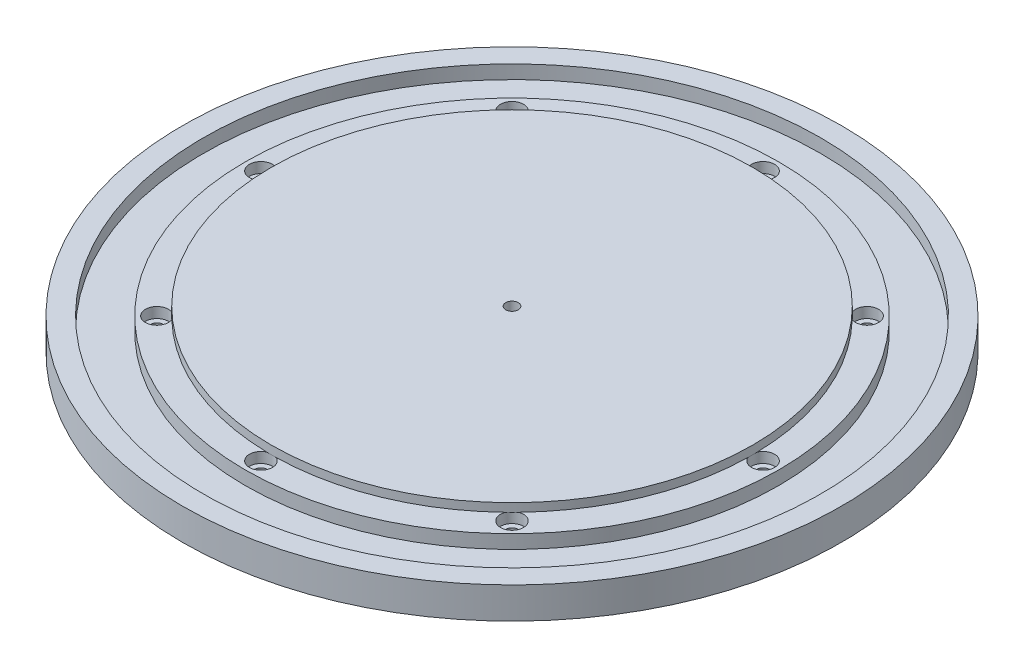
ISO-10303-21;
HEADER;
FILE_DESCRIPTION(('STEP AP214'),'2;1');
FILE_NAME('part.step','',(''),(''),'','','');
FILE_SCHEMA(('AUTOMOTIVE_DESIGN { 1 0 10303 214 1 1 1 1 }'));
ENDSEC;
DATA;
#1=APPLICATION_CONTEXT('core data for automotive mechanical design processes');
#2=APPLICATION_PROTOCOL_DEFINITION('international standard','automotive_design',2000,#1);
#3=PRODUCT_CONTEXT('',#1,'mechanical');
#4=PRODUCT('Part','Part','',(#3));
#5=PRODUCT_RELATED_PRODUCT_CATEGORY('part','',(#4));
#6=PRODUCT_DEFINITION_FORMATION('','',#4);
#7=PRODUCT_DEFINITION_CONTEXT('part definition',#1,'design');
#8=PRODUCT_DEFINITION('design','',#6,#7);
#9=PRODUCT_DEFINITION_SHAPE('','',#8);
#10=(LENGTH_UNIT() NAMED_UNIT(*) SI_UNIT(.MILLI.,.METRE.));
#11=(NAMED_UNIT(*) PLANE_ANGLE_UNIT() SI_UNIT($,.RADIAN.));
#12=(NAMED_UNIT(*) SI_UNIT($,.STERADIAN.) SOLID_ANGLE_UNIT());
#13=UNCERTAINTY_MEASURE_WITH_UNIT(LENGTH_MEASURE(1.E-05),#10,'distance_accuracy_value','');
#14=(GEOMETRIC_REPRESENTATION_CONTEXT(3) GLOBAL_UNCERTAINTY_ASSIGNED_CONTEXT((#13)) GLOBAL_UNIT_ASSIGNED_CONTEXT((#10,
#11,#12)) REPRESENTATION_CONTEXT('',''));
#15=CARTESIAN_POINT('',(0.,0.,0.));
#16=DIRECTION('',(0.,0.,1.));
#17=DIRECTION('',(1.,0.,0.));
#18=AXIS2_PLACEMENT_3D('',#15,#16,#17);
#19=CARTESIAN_POINT('',(0.,-1000.,-3.43024899888577E-12));
#20=DIRECTION('',(0.,-1.,0.));
#21=DIRECTION('',(0.,0.,-1.));
#22=AXIS2_PLACEMENT_3D('',#19,#20,#21);
#23=CYLINDRICAL_SURFACE('',#22,230.);
#24=CARTESIAN_POINT('',(0.,44.6059627643254,1.53009559116663E-13));
#25=DIRECTION('',(0.,-1.,0.));
#26=DIRECTION('',(0.,0.,-1.));
#27=AXIS2_PLACEMENT_3D('',#24,#25,#26);
#28=CIRCLE('',#27,230.);
#29=CARTESIAN_POINT('',(4.48587627309359,44.6059627643262,-229.95625));
#30=VERTEX_POINT('',#29);
#31=CARTESIAN_POINT('',(159.431630218961,44.605962764326,-165.775617283497));
#32=VERTEX_POINT('',#31);
#33=EDGE_CURVE('E139',#30,#32,#28,.T.);
#34=ORIENTED_EDGE('',*,*,#33,.F.);
#35=CARTESIAN_POINT('',(-4.48587627309347,44.6059627643262,-229.95625));
#36=VERTEX_POINT('',#35);
#37=EDGE_CURVE('E145',#36,#30,#28,.T.);
#38=ORIENTED_EDGE('',*,*,#37,.F.);
#39=CARTESIAN_POINT('',(-159.43163021896,44.605962764326,-165.775617283498));
#40=VERTEX_POINT('',#39);
#41=EDGE_CURVE('E129',#40,#36,#28,.T.);
#42=ORIENTED_EDGE('',*,*,#41,.F.);
#43=CARTESIAN_POINT('',(-165.775617283494,44.6059627643259,-159.431630218963));
#44=VERTEX_POINT('',#43);
#45=EDGE_CURVE('E117',#44,#40,#28,.T.);
#46=ORIENTED_EDGE('',*,*,#45,.F.);
#47=CARTESIAN_POINT('',(-229.95625,44.6059627643254,-4.48587627309584));
#48=VERTEX_POINT('',#47);
#49=EDGE_CURVE('E127',#48,#44,#28,.T.);
#50=ORIENTED_EDGE('',*,*,#49,.F.);
#51=CARTESIAN_POINT('',(-229.95625,44.6059627643254,4.4858762730912));
#52=VERTEX_POINT('',#51);
#53=EDGE_CURVE('E136',#52,#48,#28,.T.);
#54=ORIENTED_EDGE('',*,*,#53,.F.);
#55=CARTESIAN_POINT('',(-165.775617283498,44.6059627643248,159.43163021896));
#56=VERTEX_POINT('',#55);
#57=EDGE_CURVE('E138',#56,#52,#28,.T.);
#58=ORIENTED_EDGE('',*,*,#57,.F.);
#59=CARTESIAN_POINT('',(-159.431630218963,44.6059627643248,165.775617283495));
#60=VERTEX_POINT('',#59);
#61=EDGE_CURVE('E758',#60,#56,#28,.T.);
#62=ORIENTED_EDGE('',*,*,#61,.F.);
#63=CARTESIAN_POINT('',(-4.48587627309519,44.6059627643246,229.95625));
#64=VERTEX_POINT('',#63);
#65=EDGE_CURVE('E763',#64,#60,#28,.T.);
#66=ORIENTED_EDGE('',*,*,#65,.F.);
#67=CARTESIAN_POINT('',(4.48587627309186,44.6059627643246,229.95625));
#68=VERTEX_POINT('',#67);
#69=EDGE_CURVE('E767',#68,#64,#28,.T.);
#70=ORIENTED_EDGE('',*,*,#69,.F.);
#71=CARTESIAN_POINT('',(159.43163021896,44.6059627643248,165.775617283498));
#72=VERTEX_POINT('',#71);
#73=EDGE_CURVE('E770',#72,#68,#28,.T.);
#74=ORIENTED_EDGE('',*,*,#73,.F.);
#75=CARTESIAN_POINT('',(165.775617283496,44.6059627643248,159.431630218962));
#76=VERTEX_POINT('',#75);
#77=EDGE_CURVE('E773',#76,#72,#28,.T.);
#78=ORIENTED_EDGE('',*,*,#77,.F.);
#79=CARTESIAN_POINT('',(229.95625,44.6059627643254,4.48587627309454));
#80=VERTEX_POINT('',#79);
#81=EDGE_CURVE('E776',#80,#76,#28,.T.);
#82=ORIENTED_EDGE('',*,*,#81,.F.);
#83=CARTESIAN_POINT('',(229.95625,44.6059627643254,-4.48587627309251));
#84=VERTEX_POINT('',#83);
#85=EDGE_CURVE('E779',#84,#80,#28,.T.);
#86=ORIENTED_EDGE('',*,*,#85,.F.);
#87=CARTESIAN_POINT('',(165.775617283498,44.6059627643259,-159.43163021896));
#88=VERTEX_POINT('',#87);
#89=EDGE_CURVE('E782',#88,#84,#28,.T.);
#90=ORIENTED_EDGE('',*,*,#89,.F.);
#91=EDGE_CURVE('E144',#32,#88,#28,.T.);
#92=ORIENTED_EDGE('',*,*,#91,.F.);
#93=EDGE_LOOP('',(#34,#38,#42,#46,#50,#54,#58,#62,#66,#70,#74,#78,#82,#86,#90,#92));
#94=FACE_BOUND('',#93,.T.);
#95=CARTESIAN_POINT('',(0.,52.6059627643254,1.80451551107749E-13));
#96=DIRECTION('',(0.,-1.,0.));
#97=DIRECTION('',(0.,0.,-1.));
#98=AXIS2_PLACEMENT_3D('',#95,#96,#97);
#99=CIRCLE('',#98,230.);
#100=CARTESIAN_POINT('',(0.,52.6059627643262,-230.));
#101=VERTEX_POINT('',#100);
#102=EDGE_CURVE('E112',#101,#101,#99,.T.);
#103=ORIENTED_EDGE('',*,*,#102,.T.);
#104=EDGE_LOOP('',(#103));
#105=FACE_BOUND('',#104,.T.);
#106=ADVANCED_FACE('F39',(#94,#105),#23,.T.);
#107=CARTESIAN_POINT('',(0.,52.6059627643269,230.));
#108=DIRECTION('',(0.,-1.,0.));
#109=DIRECTION('',(0.,0.,-1.));
#110=AXIS2_PLACEMENT_3D('',#107,#108,#109);
#111=PLANE('',#110);
#112=CARTESIAN_POINT('',(0.,52.6059627643276,1.80451551107756E-13));
#113=DIRECTION('',(0.,-1.,0.));
#114=DIRECTION('',(0.,0.,-1.));
#115=AXIS2_PLACEMENT_3D('',#112,#113,#114);
#116=CIRCLE('',#115,6.);
#117=CARTESIAN_POINT('',(0.,52.6059627643277,-5.99999999999982));
#118=VERTEX_POINT('',#117);
#119=EDGE_CURVE('E290',#118,#118,#116,.F.);
#120=ORIENTED_EDGE('',*,*,#119,.F.);
#121=EDGE_LOOP('',(#120));
#122=FACE_BOUND('',#121,.T.);
#123=ORIENTED_EDGE('',*,*,#102,.F.);
#124=EDGE_LOOP('',(#123));
#125=FACE_BOUND('',#124,.T.);
#126=ADVANCED_FACE('F331',(#122,#125),#111,.F.);
#127=CARTESIAN_POINT('',(0.,14.6059627643244,315.000000001753));
#128=DIRECTION('',(0.,1.,0.));
#129=DIRECTION('',(0.,0.,1.));
#130=AXIS2_PLACEMENT_3D('',#127,#128,#129);
#131=PLANE('',#130);
#132=CARTESIAN_POINT('',(0.,14.6059627643255,0.));
#133=DIRECTION('',(0.,1.,0.));
#134=DIRECTION('',(0.,0.,1.));
#135=AXIS2_PLACEMENT_3D('',#132,#133,#134);
#136=CIRCLE('',#135,6.);
#137=CARTESIAN_POINT('',(0.,14.6059627643255,6.00000000000005));
#138=VERTEX_POINT('',#137);
#139=EDGE_CURVE('E42',#138,#138,#136,.F.);
#140=ORIENTED_EDGE('',*,*,#139,.F.);
#141=EDGE_LOOP('',(#140));
#142=FACE_BOUND('',#141,.T.);
#143=CARTESIAN_POINT('',(0.,14.6059627643264,-240.));
#144=DIRECTION('',(0.,1.,0.));
#145=DIRECTION('',(0.,0.,1.));
#146=AXIS2_PLACEMENT_3D('',#143,#144,#145);
#147=CIRCLE('',#146,6.);
#148=CARTESIAN_POINT('',(0.,14.6059627643264,-234.));
#149=VERTEX_POINT('',#148);
#150=EDGE_CURVE('E195',#149,#149,#147,.T.);
#151=ORIENTED_EDGE('',*,*,#150,.T.);
#152=EDGE_LOOP('',(#151));
#153=FACE_BOUND('',#152,.T.);
#154=CARTESIAN_POINT('',(169.705627484772,14.6059627643262,-169.705627484771));
#155=DIRECTION('',(0.,1.,0.));
#156=DIRECTION('',(0.,0.,1.));
#157=AXIS2_PLACEMENT_3D('',#154,#155,#156);
#158=CIRCLE('',#157,5.99999999999998);
#159=CARTESIAN_POINT('',(169.705627484772,14.6059627643261,-163.705627484771));
#160=VERTEX_POINT('',#159);
#161=EDGE_CURVE('E310',#160,#160,#158,.T.);
#162=ORIENTED_EDGE('',*,*,#161,.T.);
#163=EDGE_LOOP('',(#162));
#164=FACE_BOUND('',#163,.T.);
#165=CARTESIAN_POINT('',(240.000000000007,14.6059627643256,-6.72702088937757E-12));
#166=DIRECTION('',(0.,1.,0.));
#167=DIRECTION('',(0.,0.,1.));
#168=AXIS2_PLACEMENT_3D('',#165,#166,#167);
#169=CIRCLE('',#168,6.0000000000053);
#170=CARTESIAN_POINT('',(240.000000000007,14.6059627643256,5.99999999999857));
#171=VERTEX_POINT('',#170);
#172=EDGE_CURVE('E306',#171,#171,#169,.T.);
#173=ORIENTED_EDGE('',*,*,#172,.T.);
#174=EDGE_LOOP('',(#173));
#175=FACE_BOUND('',#174,.T.);
#176=CARTESIAN_POINT('',(169.705627484783,14.605962764325,169.705627484767));
#177=DIRECTION('',(0.,1.,0.));
#178=DIRECTION('',(0.,0.,1.));
#179=AXIS2_PLACEMENT_3D('',#176,#177,#178);
#180=CIRCLE('',#179,6.00000000001086);
#181=CARTESIAN_POINT('',(169.705627484783,14.605962764325,175.705627484778));
#182=VERTEX_POINT('',#181);
#183=EDGE_CURVE('E302',#182,#182,#180,.T.);
#184=ORIENTED_EDGE('',*,*,#183,.T.);
#185=EDGE_LOOP('',(#184));
#186=FACE_BOUND('',#185,.T.);
#187=CARTESIAN_POINT('',(1.35542459570553E-11,14.6059627643247,240.));
#188=DIRECTION('',(0.,1.,0.));
#189=DIRECTION('',(0.,0.,1.));
#190=AXIS2_PLACEMENT_3D('',#187,#188,#189);
#191=CIRCLE('',#190,6.00000000001457);
#192=CARTESIAN_POINT('',(1.35542459570553E-11,14.6059627643247,246.000000000015));
#193=VERTEX_POINT('',#192);
#194=EDGE_CURVE('E298',#193,#193,#191,.T.);
#195=ORIENTED_EDGE('',*,*,#194,.T.);
#196=EDGE_LOOP('',(#195));
#197=FACE_BOUND('',#196,.T.);
#198=CARTESIAN_POINT('',(-169.70562748476,14.605962764325,169.705627484776));
#199=DIRECTION('',(0.,1.,0.));
#200=DIRECTION('',(0.,0.,1.));
#201=AXIS2_PLACEMENT_3D('',#198,#199,#200);
#202=CIRCLE('',#201,6.00000000001452);
#203=CARTESIAN_POINT('',(-169.70562748476,14.605962764325,175.705627484791));
#204=VERTEX_POINT('',#203);
#205=EDGE_CURVE('E294',#204,#204,#202,.T.);
#206=ORIENTED_EDGE('',*,*,#205,.T.);
#207=EDGE_LOOP('',(#206));
#208=FACE_BOUND('',#207,.T.);
#209=CARTESIAN_POINT('',(-239.999999999993,14.6059627643256,6.85661659085728E-12));
#210=DIRECTION('',(0.,1.,0.));
#211=DIRECTION('',(0.,0.,1.));
#212=AXIS2_PLACEMENT_3D('',#209,#210,#211);
#213=CIRCLE('',#212,6.0000000000109);
#214=CARTESIAN_POINT('',(-239.999999999993,14.6059627643256,6.00000000001776));
#215=VERTEX_POINT('',#214);
#216=EDGE_CURVE('E289',#215,#215,#213,.T.);
#217=ORIENTED_EDGE('',*,*,#216,.T.);
#218=EDGE_LOOP('',(#217));
#219=FACE_BOUND('',#218,.T.);
#220=CARTESIAN_POINT('',(-169.705627484769,14.6059627643262,-169.705627484767));
#221=DIRECTION('',(0.,1.,0.));
#222=DIRECTION('',(0.,0.,1.));
#223=AXIS2_PLACEMENT_3D('',#220,#221,#222);
#224=CIRCLE('',#223,6.00000000000615);
#225=CARTESIAN_POINT('',(-169.705627484769,14.6059627643261,-163.70562748476));
#226=VERTEX_POINT('',#225);
#227=EDGE_CURVE('E285',#226,#226,#224,.T.);
#228=ORIENTED_EDGE('',*,*,#227,.T.);
#229=EDGE_LOOP('',(#228));
#230=FACE_BOUND('',#229,.T.);
#231=CARTESIAN_POINT('',(0.,14.6059627643256,0.));
#232=DIRECTION('',(0.,-1.,0.));
#233=DIRECTION('',(0.,0.,-1.));
#234=AXIS2_PLACEMENT_3D('',#231,#232,#233);
#235=CIRCLE('',#234,315.000000001753);
#236=CARTESIAN_POINT('',(0.,14.6059627643267,-315.000000001753));
#237=VERTEX_POINT('',#236);
#238=EDGE_CURVE('E166',#237,#237,#235,.T.);
#239=ORIENTED_EDGE('',*,*,#238,.T.);
#240=EDGE_LOOP('',(#239));
#241=FACE_BOUND('',#240,.T.);
#242=ADVANCED_FACE('F327',(#142,#153,#164,#175,#186,#197,#208,#219,#230,#241),#131,.F.);
#243=CARTESIAN_POINT('',(0.,-1000.,-3.43024899888577E-12));
#244=DIRECTION('',(0.,-1.,0.));
#245=DIRECTION('',(0.,0.,-1.));
#246=AXIS2_PLACEMENT_3D('',#243,#244,#245);
#247=CYLINDRICAL_SURFACE('',#246,315.000000001753);
#248=ORIENTED_EDGE('',*,*,#238,.F.);
#249=EDGE_LOOP('',(#248));
#250=FACE_BOUND('',#249,.T.);
#251=CARTESIAN_POINT('',(0.,44.6059627643256,1.53009559116663E-13));
#252=DIRECTION('',(0.,-1.,0.));
#253=DIRECTION('',(0.,0.,-1.));
#254=AXIS2_PLACEMENT_3D('',#251,#252,#253);
#255=CIRCLE('',#254,315.000000001753);
#256=CARTESIAN_POINT('',(0.,44.6059627643267,-315.000000001753));
#257=VERTEX_POINT('',#256);
#258=EDGE_CURVE('E162',#257,#257,#255,.T.);
#259=ORIENTED_EDGE('',*,*,#258,.T.);
#260=EDGE_LOOP('',(#259));
#261=FACE_BOUND('',#260,.T.);
#262=ADVANCED_FACE('F330',(#250,#261),#247,.T.);
#263=CARTESIAN_POINT('',(0.,44.6059627643245,315.000000001753));
#264=DIRECTION('',(0.,-1.,0.));
#265=DIRECTION('',(0.,0.,-1.));
#266=AXIS2_PLACEMENT_3D('',#263,#264,#265);
#267=PLANE('',#266);
#268=ORIENTED_EDGE('',*,*,#258,.F.);
#269=EDGE_LOOP('',(#268));
#270=FACE_BOUND('',#269,.T.);
#271=CARTESIAN_POINT('',(0.,44.6059627643256,1.53009559116663E-13));
#272=DIRECTION('',(0.,-1.,0.));
#273=DIRECTION('',(0.,0.,-1.));
#274=AXIS2_PLACEMENT_3D('',#271,#272,#273);
#275=CIRCLE('',#274,295.000000001753);
#276=CARTESIAN_POINT('',(0.,44.6059627643266,-295.000000001753));
#277=VERTEX_POINT('',#276);
#278=EDGE_CURVE('E158',#277,#277,#275,.T.);
#279=ORIENTED_EDGE('',*,*,#278,.T.);
#280=EDGE_LOOP('',(#279));
#281=FACE_BOUND('',#280,.T.);
#282=ADVANCED_FACE('F353',(#270,#281),#267,.F.);
#283=CARTESIAN_POINT('',(0.,-1000.,-3.43024899888577E-12));
#284=DIRECTION('',(0.,-1.,0.));
#285=DIRECTION('',(0.,0.,-1.));
#286=AXIS2_PLACEMENT_3D('',#283,#284,#285);
#287=CYLINDRICAL_SURFACE('',#286,295.000000001753);
#288=ORIENTED_EDGE('',*,*,#278,.F.);
#289=EDGE_LOOP('',(#288));
#290=FACE_BOUND('',#289,.T.);
#291=CARTESIAN_POINT('',(0.,31.6059627643257,1.08416322131149E-13));
#292=DIRECTION('',(0.,-1.,0.));
#293=DIRECTION('',(0.,0.,-1.));
#294=AXIS2_PLACEMENT_3D('',#291,#292,#293);
#295=CIRCLE('',#294,295.000000001753);
#296=CARTESIAN_POINT('',(0.,31.6059627643267,-295.000000001753));
#297=VERTEX_POINT('',#296);
#298=EDGE_CURVE('E154',#297,#297,#295,.T.);
#299=ORIENTED_EDGE('',*,*,#298,.T.);
#300=EDGE_LOOP('',(#299));
#301=FACE_BOUND('',#300,.T.);
#302=ADVANCED_FACE('F359',(#290,#301),#287,.F.);
#303=CARTESIAN_POINT('',(0.,31.6059627643245,295.000000001753));
#304=DIRECTION('',(0.,-1.,0.));
#305=DIRECTION('',(0.,0.,-1.));
#306=AXIS2_PLACEMENT_3D('',#303,#304,#305);
#307=PLANE('',#306);
#308=ORIENTED_EDGE('',*,*,#298,.F.);
#309=EDGE_LOOP('',(#308));
#310=FACE_BOUND('',#309,.T.);
#311=CARTESIAN_POINT('',(0.,31.6059627643255,1.08416322131148E-13));
#312=DIRECTION('',(0.,-1.,0.));
#313=DIRECTION('',(0.,0.,-1.));
#314=AXIS2_PLACEMENT_3D('',#311,#312,#313);
#315=CIRCLE('',#314,255.000000001753);
#316=CARTESIAN_POINT('',(0.,31.6059627643264,-255.000000001753));
#317=VERTEX_POINT('',#316);
#318=EDGE_CURVE('E150',#317,#317,#315,.T.);
#319=ORIENTED_EDGE('',*,*,#318,.T.);
#320=EDGE_LOOP('',(#319));
#321=FACE_BOUND('',#320,.T.);
#322=ADVANCED_FACE('F365',(#310,#321),#307,.F.);
#323=CARTESIAN_POINT('',(0.,-1000.,-3.43024899888577E-12));
#324=DIRECTION('',(0.,-1.,0.));
#325=DIRECTION('',(0.,0.,-1.));
#326=AXIS2_PLACEMENT_3D('',#323,#324,#325);
#327=CYLINDRICAL_SURFACE('',#326,255.000000001753);
#328=ORIENTED_EDGE('',*,*,#318,.F.);
#329=EDGE_LOOP('',(#328));
#330=FACE_BOUND('',#329,.T.);
#331=CARTESIAN_POINT('',(0.,44.6059627643254,1.53009559116663E-13));
#332=DIRECTION('',(0.,-1.,0.));
#333=DIRECTION('',(0.,0.,-1.));
#334=AXIS2_PLACEMENT_3D('',#331,#332,#333);
#335=CIRCLE('',#334,255.000000001753);
#336=CARTESIAN_POINT('',(0.,44.6059627643263,-255.000000001753));
#337=VERTEX_POINT('',#336);
#338=EDGE_CURVE('E143',#337,#337,#335,.T.);
#339=ORIENTED_EDGE('',*,*,#338,.T.);
#340=EDGE_LOOP('',(#339));
#341=FACE_BOUND('',#340,.T.);
#342=ADVANCED_FACE('F371',(#330,#341),#327,.T.);
#343=CARTESIAN_POINT('',(0.,44.6059627643245,255.000000001753));
#344=DIRECTION('',(0.,-1.,0.));
#345=DIRECTION('',(0.,0.,-1.));
#346=AXIS2_PLACEMENT_3D('',#343,#344,#345);
#347=PLANE('',#346);
#348=ORIENTED_EDGE('',*,*,#338,.F.);
#349=EDGE_LOOP('',(#348));
#350=FACE_BOUND('',#349,.T.);
#351=ORIENTED_EDGE('',*,*,#41,.T.);
#352=CARTESIAN_POINT('',(0.,44.6059627643262,-240.));
#353=DIRECTION('',(0.,1.,0.));
#354=DIRECTION('',(0.,0.,1.));
#355=AXIS2_PLACEMENT_3D('',#352,#353,#354);
#356=CIRCLE('',#355,11.);
#357=EDGE_CURVE('E277',#30,#36,#356,.T.);
#358=ORIENTED_EDGE('',*,*,#357,.F.);
#359=ORIENTED_EDGE('',*,*,#33,.T.);
#360=CARTESIAN_POINT('',(169.705627484772,44.605962764326,-169.705627484771));
#361=DIRECTION('',(0.,-1.,0.));
#362=DIRECTION('',(0.,0.,-1.));
#363=AXIS2_PLACEMENT_3D('',#360,#361,#362);
#364=CIRCLE('',#363,11.);
#365=EDGE_CURVE('E11',#32,#88,#364,.T.);
#366=ORIENTED_EDGE('',*,*,#365,.T.);
#367=ORIENTED_EDGE('',*,*,#89,.T.);
#368=CARTESIAN_POINT('',(240.,44.6059627643254,9.90965080439015E-13));
#369=DIRECTION('',(0.,-1.,0.));
#370=DIRECTION('',(0.,0.,-1.));
#371=AXIS2_PLACEMENT_3D('',#368,#369,#370);
#372=CIRCLE('',#371,11.);
#373=EDGE_CURVE('E48',#84,#80,#372,.T.);
#374=ORIENTED_EDGE('',*,*,#373,.T.);
#375=ORIENTED_EDGE('',*,*,#81,.T.);
#376=CARTESIAN_POINT('',(169.70562748477,44.6059627643248,169.705627484772));
#377=DIRECTION('',(0.,-1.,0.));
#378=DIRECTION('',(0.,0.,-1.));
#379=AXIS2_PLACEMENT_3D('',#376,#377,#378);
#380=CIRCLE('',#379,11.);
#381=EDGE_CURVE('E183',#76,#72,#380,.T.);
#382=ORIENTED_EDGE('',*,*,#381,.T.);
#383=ORIENTED_EDGE('',*,*,#73,.T.);
#384=CARTESIAN_POINT('',(-1.6759110426447E-12,44.6059627643246,240.));
#385=DIRECTION('',(0.,-1.,0.));
#386=DIRECTION('',(0.,0.,-1.));
#387=AXIS2_PLACEMENT_3D('',#384,#385,#386);
#388=CIRCLE('',#387,11.);
#389=EDGE_CURVE('E179',#68,#64,#388,.T.);
#390=ORIENTED_EDGE('',*,*,#389,.T.);
#391=ORIENTED_EDGE('',*,*,#65,.T.);
#392=CARTESIAN_POINT('',(-169.705627484773,44.6059627643248,169.70562748477));
#393=DIRECTION('',(0.,-1.,0.));
#394=DIRECTION('',(0.,0.,-1.));
#395=AXIS2_PLACEMENT_3D('',#392,#393,#394);
#396=CIRCLE('',#395,11.);
#397=EDGE_CURVE('E175',#60,#56,#396,.T.);
#398=ORIENTED_EDGE('',*,*,#397,.T.);
#399=ORIENTED_EDGE('',*,*,#57,.T.);
#400=CARTESIAN_POINT('',(-240.,44.6059627643254,-2.36085700485039E-12));
#401=DIRECTION('',(0.,-1.,0.));
#402=DIRECTION('',(0.,0.,-1.));
#403=AXIS2_PLACEMENT_3D('',#400,#401,#402);
#404=CIRCLE('',#403,11.);
#405=EDGE_CURVE('E111',#52,#48,#404,.T.);
#406=ORIENTED_EDGE('',*,*,#405,.T.);
#407=ORIENTED_EDGE('',*,*,#49,.T.);
#408=CARTESIAN_POINT('',(-169.705627484769,44.605962764326,-169.705627484773));
#409=DIRECTION('',(0.,-1.,0.));
#410=DIRECTION('',(0.,0.,-1.));
#411=AXIS2_PLACEMENT_3D('',#408,#409,#410);
#412=CIRCLE('',#411,11.);
#413=EDGE_CURVE('E104',#44,#40,#412,.T.);
#414=ORIENTED_EDGE('',*,*,#413,.T.);
#415=EDGE_LOOP('',(#351,#358,#359,#366,#367,#374,#375,#382,#383,#390,#391,#398,#399,#406,#407,#414));
#416=FACE_BOUND('',#415,.T.);
#417=ADVANCED_FACE('F133',(#350,#416),#347,.F.);
#418=CARTESIAN_POINT('',(-169.705627484769,44.605962764326,-169.705627484773));
#419=DIRECTION('',(0.,1.,0.));
#420=DIRECTION('',(0.,0.,1.));
#421=AXIS2_PLACEMENT_3D('',#418,#419,#420);
#422=PLANE('',#421);
#423=CARTESIAN_POINT('',(-169.705627484769,44.605962764326,-169.705627484773));
#424=DIRECTION('',(0.,1.,0.));
#425=DIRECTION('',(0.,0.,1.));
#426=AXIS2_PLACEMENT_3D('',#423,#424,#425);
#427=CIRCLE('',#426,11.);
#428=EDGE_CURVE('E55',#44,#40,#427,.T.);
#429=ORIENTED_EDGE('',*,*,#428,.F.);
#430=ORIENTED_EDGE('',*,*,#45,.T.);
#431=EDGE_LOOP('',(#429,#430));
#432=FACE_BOUND('',#431,.T.);
#433=ADVANCED_FACE('F116',(#432),#422,.F.);
#434=CARTESIAN_POINT('',(-169.705627484769,34.605962764326,-169.705627484773));
#435=DIRECTION('',(0.,1.,0.));
#436=DIRECTION('',(0.,0.,1.));
#437=AXIS2_PLACEMENT_3D('',#434,#435,#436);
#438=CYLINDRICAL_SURFACE('',#437,11.);
#439=CARTESIAN_POINT('',(-169.705627484769,34.605962764326,-169.705627484773));
#440=DIRECTION('',(0.,1.,0.));
#441=DIRECTION('',(0.,0.,1.));
#442=AXIS2_PLACEMENT_3D('',#439,#440,#441);
#443=CIRCLE('',#442,11.);
#444=CARTESIAN_POINT('',(-169.705627484769,34.6059627643259,-158.705627484773));
#445=VERTEX_POINT('',#444);
#446=EDGE_CURVE('E119',#445,#445,#443,.T.);
#447=ORIENTED_EDGE('',*,*,#446,.F.);
#448=EDGE_LOOP('',(#447));
#449=FACE_BOUND('',#448,.T.);
#450=ORIENTED_EDGE('',*,*,#428,.T.);
#451=ORIENTED_EDGE('',*,*,#413,.F.);
#452=EDGE_LOOP('',(#450,#451));
#453=FACE_BOUND('',#452,.T.);
#454=ADVANCED_FACE('F105',(#449,#453),#438,.F.);
#455=CARTESIAN_POINT('',(-169.705627484769,34.605962764326,-169.705627484773));
#456=DIRECTION('',(0.,1.,0.));
#457=DIRECTION('',(0.,0.,1.));
#458=AXIS2_PLACEMENT_3D('',#455,#456,#457);
#459=PLANE('',#458);
#460=CARTESIAN_POINT('',(-169.705627484769,34.605962764326,-169.705627484766));
#461=DIRECTION('',(0.,1.,0.));
#462=DIRECTION('',(0.,0.,1.));
#463=AXIS2_PLACEMENT_3D('',#460,#461,#462);
#464=CIRCLE('',#463,6.00000000000615);
#465=CARTESIAN_POINT('',(-169.705627484769,34.6059627643259,-163.70562748476));
#466=VERTEX_POINT('',#465);
#467=EDGE_CURVE('E120',#466,#466,#464,.T.);
#468=ORIENTED_EDGE('',*,*,#467,.F.);
#469=EDGE_LOOP('',(#468));
#470=FACE_BOUND('',#469,.T.);
#471=ORIENTED_EDGE('',*,*,#446,.T.);
#472=EDGE_LOOP('',(#471));
#473=FACE_BOUND('',#472,.T.);
#474=ADVANCED_FACE('F225',(#470,#473),#459,.T.);
#475=CARTESIAN_POINT('',(-240.,44.6059627643254,-2.36085700485039E-12));
#476=DIRECTION('',(0.,1.,0.));
#477=DIRECTION('',(0.,0.,1.));
#478=AXIS2_PLACEMENT_3D('',#475,#476,#477);
#479=PLANE('',#478);
#480=CARTESIAN_POINT('',(-240.,44.6059627643254,-2.36085700485039E-12));
#481=DIRECTION('',(0.,1.,0.));
#482=DIRECTION('',(0.,0.,1.));
#483=AXIS2_PLACEMENT_3D('',#480,#481,#482);
#484=CIRCLE('',#483,11.);
#485=EDGE_CURVE('E62',#52,#48,#484,.T.);
#486=ORIENTED_EDGE('',*,*,#485,.F.);
#487=ORIENTED_EDGE('',*,*,#53,.T.);
#488=EDGE_LOOP('',(#486,#487));
#489=FACE_BOUND('',#488,.T.);
#490=ADVANCED_FACE('F228',(#489),#479,.F.);
#491=CARTESIAN_POINT('',(-240.,34.6059627643254,-2.39515949483925E-12));
#492=DIRECTION('',(0.,1.,0.));
#493=DIRECTION('',(0.,0.,1.));
#494=AXIS2_PLACEMENT_3D('',#491,#492,#493);
#495=CYLINDRICAL_SURFACE('',#494,11.);
#496=CARTESIAN_POINT('',(-240.,34.6059627643254,-2.39515949483925E-12));
#497=DIRECTION('',(0.,1.,0.));
#498=DIRECTION('',(0.,0.,1.));
#499=AXIS2_PLACEMENT_3D('',#496,#497,#498);
#500=CIRCLE('',#499,11.);
#501=CARTESIAN_POINT('',(-240.,34.6059627643253,10.9999999999976));
#502=VERTEX_POINT('',#501);
#503=EDGE_CURVE('E235',#502,#502,#500,.T.);
#504=ORIENTED_EDGE('',*,*,#503,.F.);
#505=EDGE_LOOP('',(#504));
#506=FACE_BOUND('',#505,.T.);
#507=ORIENTED_EDGE('',*,*,#485,.T.);
#508=ORIENTED_EDGE('',*,*,#405,.F.);
#509=EDGE_LOOP('',(#507,#508));
#510=FACE_BOUND('',#509,.T.);
#511=ADVANCED_FACE('F453',(#506,#510),#495,.F.);
#512=CARTESIAN_POINT('',(-240.,34.6059627643254,-2.39515949483925E-12));
#513=DIRECTION('',(0.,1.,0.));
#514=DIRECTION('',(0.,0.,1.));
#515=AXIS2_PLACEMENT_3D('',#512,#513,#514);
#516=PLANE('',#515);
#517=CARTESIAN_POINT('',(-239.999999999993,34.6059627643254,6.925221570835E-12));
#518=DIRECTION('',(0.,1.,0.));
#519=DIRECTION('',(0.,0.,1.));
#520=AXIS2_PLACEMENT_3D('',#517,#518,#519);
#521=CIRCLE('',#520,6.0000000000109);
#522=CARTESIAN_POINT('',(-239.999999999993,34.6059627643254,6.00000000001783));
#523=VERTEX_POINT('',#522);
#524=EDGE_CURVE('E215',#523,#523,#521,.T.);
#525=ORIENTED_EDGE('',*,*,#524,.F.);
#526=EDGE_LOOP('',(#525));
#527=FACE_BOUND('',#526,.T.);
#528=ORIENTED_EDGE('',*,*,#503,.T.);
#529=EDGE_LOOP('',(#528));
#530=FACE_BOUND('',#529,.T.);
#531=ADVANCED_FACE('F463',(#527,#530),#516,.T.);
#532=CARTESIAN_POINT('',(-169.705627484773,44.6059627643248,169.70562748477));
#533=DIRECTION('',(0.,1.,0.));
#534=DIRECTION('',(0.,0.,1.));
#535=AXIS2_PLACEMENT_3D('',#532,#533,#534);
#536=PLANE('',#535);
#537=CARTESIAN_POINT('',(-169.705627484773,44.6059627643248,169.70562748477));
#538=DIRECTION('',(0.,1.,0.));
#539=DIRECTION('',(0.,0.,1.));
#540=AXIS2_PLACEMENT_3D('',#537,#538,#539);
#541=CIRCLE('',#540,11.);
#542=EDGE_CURVE('E241',#60,#56,#541,.T.);
#543=ORIENTED_EDGE('',*,*,#542,.F.);
#544=ORIENTED_EDGE('',*,*,#61,.T.);
#545=EDGE_LOOP('',(#543,#544));
#546=FACE_BOUND('',#545,.T.);
#547=ADVANCED_FACE('F471',(#546),#536,.F.);
#548=CARTESIAN_POINT('',(-169.705627484773,34.6059627643248,169.70562748477));
#549=DIRECTION('',(0.,1.,0.));
#550=DIRECTION('',(0.,0.,1.));
#551=AXIS2_PLACEMENT_3D('',#548,#549,#550);
#552=CYLINDRICAL_SURFACE('',#551,11.);
#553=CARTESIAN_POINT('',(-169.705627484773,34.6059627643248,169.70562748477));
#554=DIRECTION('',(0.,1.,0.));
#555=DIRECTION('',(0.,0.,1.));
#556=AXIS2_PLACEMENT_3D('',#553,#554,#555);
#557=CIRCLE('',#556,11.);
#558=CARTESIAN_POINT('',(-169.705627484773,34.6059627643248,180.70562748477));
#559=VERTEX_POINT('',#558);
#560=EDGE_CURVE('E244',#559,#559,#557,.T.);
#561=ORIENTED_EDGE('',*,*,#560,.F.);
#562=EDGE_LOOP('',(#561));
#563=FACE_BOUND('',#562,.T.);
#564=ORIENTED_EDGE('',*,*,#542,.T.);
#565=ORIENTED_EDGE('',*,*,#397,.F.);
#566=EDGE_LOOP('',(#564,#565));
#567=FACE_BOUND('',#566,.T.);
#568=ADVANCED_FACE('F476',(#563,#567),#552,.F.);
#569=CARTESIAN_POINT('',(-169.705627484773,34.6059627643248,169.70562748477));
#570=DIRECTION('',(0.,1.,0.));
#571=DIRECTION('',(0.,0.,1.));
#572=AXIS2_PLACEMENT_3D('',#569,#570,#571);
#573=PLANE('',#572);
#574=CARTESIAN_POINT('',(-169.70562748476,34.6059627643248,169.705627484776));
#575=DIRECTION('',(0.,1.,0.));
#576=DIRECTION('',(0.,0.,1.));
#577=AXIS2_PLACEMENT_3D('',#574,#575,#576);
#578=CIRCLE('',#577,6.00000000001452);
#579=CARTESIAN_POINT('',(-169.70562748476,34.6059627643248,175.705627484791));
#580=VERTEX_POINT('',#579);
#581=EDGE_CURVE('E211',#580,#580,#578,.T.);
#582=ORIENTED_EDGE('',*,*,#581,.F.);
#583=EDGE_LOOP('',(#582));
#584=FACE_BOUND('',#583,.T.);
#585=ORIENTED_EDGE('',*,*,#560,.T.);
#586=EDGE_LOOP('',(#585));
#587=FACE_BOUND('',#586,.T.);
#588=ADVANCED_FACE('F486',(#584,#587),#573,.T.);
#589=CARTESIAN_POINT('',(-1.6759110426447E-12,44.6059627643246,240.));
#590=DIRECTION('',(0.,1.,0.));
#591=DIRECTION('',(0.,0.,1.));
#592=AXIS2_PLACEMENT_3D('',#589,#590,#591);
#593=PLANE('',#592);
#594=CARTESIAN_POINT('',(-1.6759110426447E-12,44.6059627643246,240.));
#595=DIRECTION('',(0.,1.,0.));
#596=DIRECTION('',(0.,0.,1.));
#597=AXIS2_PLACEMENT_3D('',#594,#595,#596);
#598=CIRCLE('',#597,11.);
#599=EDGE_CURVE('E248',#68,#64,#598,.T.);
#600=ORIENTED_EDGE('',*,*,#599,.F.);
#601=ORIENTED_EDGE('',*,*,#69,.T.);
#602=EDGE_LOOP('',(#600,#601));
#603=FACE_BOUND('',#602,.T.);
#604=ADVANCED_FACE('F494',(#603),#593,.F.);
#605=CARTESIAN_POINT('',(-1.6759110426447E-12,34.6059627643246,240.));
#606=DIRECTION('',(0.,1.,0.));
#607=DIRECTION('',(0.,0.,1.));
#608=AXIS2_PLACEMENT_3D('',#605,#606,#607);
#609=CYLINDRICAL_SURFACE('',#608,11.);
#610=CARTESIAN_POINT('',(-1.6759110426447E-12,34.6059627643246,240.));
#611=DIRECTION('',(0.,1.,0.));
#612=DIRECTION('',(0.,0.,1.));
#613=AXIS2_PLACEMENT_3D('',#610,#611,#612);
#614=CIRCLE('',#613,11.);
#615=CARTESIAN_POINT('',(-1.6759110426447E-12,34.6059627643245,251.));
#616=VERTEX_POINT('',#615);
#617=EDGE_CURVE('E251',#616,#616,#614,.T.);
#618=ORIENTED_EDGE('',*,*,#617,.F.);
#619=EDGE_LOOP('',(#618));
#620=FACE_BOUND('',#619,.T.);
#621=ORIENTED_EDGE('',*,*,#599,.T.);
#622=ORIENTED_EDGE('',*,*,#389,.F.);
#623=EDGE_LOOP('',(#621,#622));
#624=FACE_BOUND('',#623,.T.);
#625=ADVANCED_FACE('F499',(#620,#624),#609,.F.);
#626=CARTESIAN_POINT('',(-1.6759110426447E-12,34.6059627643246,240.));
#627=DIRECTION('',(0.,1.,0.));
#628=DIRECTION('',(0.,0.,1.));
#629=AXIS2_PLACEMENT_3D('',#626,#627,#628);
#630=PLANE('',#629);
#631=CARTESIAN_POINT('',(1.35542459570553E-11,34.6059627643246,240.));
#632=DIRECTION('',(0.,1.,0.));
#633=DIRECTION('',(0.,0.,1.));
#634=AXIS2_PLACEMENT_3D('',#631,#632,#633);
#635=CIRCLE('',#634,6.00000000001457);
#636=CARTESIAN_POINT('',(1.35542459570553E-11,34.6059627643245,246.000000000015));
#637=VERTEX_POINT('',#636);
#638=EDGE_CURVE('E207',#637,#637,#635,.T.);
#639=ORIENTED_EDGE('',*,*,#638,.F.);
#640=EDGE_LOOP('',(#639));
#641=FACE_BOUND('',#640,.T.);
#642=ORIENTED_EDGE('',*,*,#617,.T.);
#643=EDGE_LOOP('',(#642));
#644=FACE_BOUND('',#643,.T.);
#645=ADVANCED_FACE('F509',(#641,#644),#630,.T.);
#646=CARTESIAN_POINT('',(169.70562748477,44.6059627643248,169.705627484772));
#647=DIRECTION('',(0.,1.,0.));
#648=DIRECTION('',(0.,0.,1.));
#649=AXIS2_PLACEMENT_3D('',#646,#647,#648);
#650=PLANE('',#649);
#651=CARTESIAN_POINT('',(169.70562748477,44.6059627643248,169.705627484772));
#652=DIRECTION('',(0.,1.,0.));
#653=DIRECTION('',(0.,0.,1.));
#654=AXIS2_PLACEMENT_3D('',#651,#652,#653);
#655=CIRCLE('',#654,11.);
#656=EDGE_CURVE('E255',#76,#72,#655,.T.);
#657=ORIENTED_EDGE('',*,*,#656,.F.);
#658=ORIENTED_EDGE('',*,*,#77,.T.);
#659=EDGE_LOOP('',(#657,#658));
#660=FACE_BOUND('',#659,.T.);
#661=ADVANCED_FACE('F517',(#660),#650,.F.);
#662=CARTESIAN_POINT('',(169.70562748477,34.6059627643248,169.705627484772));
#663=DIRECTION('',(0.,1.,0.));
#664=DIRECTION('',(0.,0.,1.));
#665=AXIS2_PLACEMENT_3D('',#662,#663,#664);
#666=CYLINDRICAL_SURFACE('',#665,11.);
#667=CARTESIAN_POINT('',(169.70562748477,34.6059627643248,169.705627484772));
#668=DIRECTION('',(0.,1.,0.));
#669=DIRECTION('',(0.,0.,1.));
#670=AXIS2_PLACEMENT_3D('',#667,#668,#669);
#671=CIRCLE('',#670,11.);
#672=CARTESIAN_POINT('',(169.70562748477,34.6059627643248,180.705627484772));
#673=VERTEX_POINT('',#672);
#674=EDGE_CURVE('E258',#673,#673,#671,.T.);
#675=ORIENTED_EDGE('',*,*,#674,.F.);
#676=EDGE_LOOP('',(#675));
#677=FACE_BOUND('',#676,.T.);
#678=ORIENTED_EDGE('',*,*,#656,.T.);
#679=ORIENTED_EDGE('',*,*,#381,.F.);
#680=EDGE_LOOP('',(#678,#679));
#681=FACE_BOUND('',#680,.T.);
#682=ADVANCED_FACE('F522',(#677,#681),#666,.F.);
#683=CARTESIAN_POINT('',(169.70562748477,34.6059627643248,169.705627484772));
#684=DIRECTION('',(0.,1.,0.));
#685=DIRECTION('',(0.,0.,1.));
#686=AXIS2_PLACEMENT_3D('',#683,#684,#685);
#687=PLANE('',#686);
#688=CARTESIAN_POINT('',(169.705627484783,34.6059627643248,169.705627484767));
#689=DIRECTION('',(0.,1.,0.));
#690=DIRECTION('',(0.,0.,1.));
#691=AXIS2_PLACEMENT_3D('',#688,#689,#690);
#692=CIRCLE('',#691,6.00000000001086);
#693=CARTESIAN_POINT('',(169.705627484783,34.6059627643248,175.705627484778));
#694=VERTEX_POINT('',#693);
#695=EDGE_CURVE('E203',#694,#694,#692,.T.);
#696=ORIENTED_EDGE('',*,*,#695,.F.);
#697=EDGE_LOOP('',(#696));
#698=FACE_BOUND('',#697,.T.);
#699=ORIENTED_EDGE('',*,*,#674,.T.);
#700=EDGE_LOOP('',(#699));
#701=FACE_BOUND('',#700,.T.);
#702=ADVANCED_FACE('F532',(#698,#701),#687,.T.);
#703=CARTESIAN_POINT('',(240.,44.6059627643254,9.90965080439015E-13));
#704=DIRECTION('',(0.,1.,0.));
#705=DIRECTION('',(0.,0.,1.));
#706=AXIS2_PLACEMENT_3D('',#703,#704,#705);
#707=PLANE('',#706);
#708=CARTESIAN_POINT('',(240.,44.6059627643254,9.90965080439015E-13));
#709=DIRECTION('',(0.,1.,0.));
#710=DIRECTION('',(0.,0.,1.));
#711=AXIS2_PLACEMENT_3D('',#708,#709,#710);
#712=CIRCLE('',#711,11.);
#713=EDGE_CURVE('E262',#84,#80,#712,.T.);
#714=ORIENTED_EDGE('',*,*,#713,.F.);
#715=ORIENTED_EDGE('',*,*,#85,.T.);
#716=EDGE_LOOP('',(#714,#715));
#717=FACE_BOUND('',#716,.T.);
#718=ADVANCED_FACE('F540',(#717),#707,.F.);
#719=CARTESIAN_POINT('',(240.,34.6059627643254,9.56662590450157E-13));
#720=DIRECTION('',(0.,1.,0.));
#721=DIRECTION('',(0.,0.,1.));
#722=AXIS2_PLACEMENT_3D('',#719,#720,#721);
#723=CYLINDRICAL_SURFACE('',#722,11.);
#724=CARTESIAN_POINT('',(240.,34.6059627643254,9.56662590450157E-13));
#725=DIRECTION('',(0.,1.,0.));
#726=DIRECTION('',(0.,0.,1.));
#727=AXIS2_PLACEMENT_3D('',#724,#725,#726);
#728=CIRCLE('',#727,11.);
#729=CARTESIAN_POINT('',(240.,34.6059627643253,11.000000000001));
#730=VERTEX_POINT('',#729);
#731=EDGE_CURVE('E265',#730,#730,#728,.T.);
#732=ORIENTED_EDGE('',*,*,#731,.F.);
#733=EDGE_LOOP('',(#732));
#734=FACE_BOUND('',#733,.T.);
#735=ORIENTED_EDGE('',*,*,#713,.T.);
#736=ORIENTED_EDGE('',*,*,#373,.F.);
#737=EDGE_LOOP('',(#735,#736));
#738=FACE_BOUND('',#737,.T.);
#739=ADVANCED_FACE('F545',(#734,#738),#723,.F.);
#740=CARTESIAN_POINT('',(240.,34.6059627643254,9.56662590450157E-13));
#741=DIRECTION('',(0.,1.,0.));
#742=DIRECTION('',(0.,0.,1.));
#743=AXIS2_PLACEMENT_3D('',#740,#741,#742);
#744=PLANE('',#743);
#745=CARTESIAN_POINT('',(240.000000000007,34.6059627643254,-6.65841590939985E-12));
#746=DIRECTION('',(0.,1.,0.));
#747=DIRECTION('',(0.,0.,1.));
#748=AXIS2_PLACEMENT_3D('',#745,#746,#747);
#749=CIRCLE('',#748,6.0000000000053);
#750=CARTESIAN_POINT('',(240.000000000007,34.6059627643254,5.99999999999864));
#751=VERTEX_POINT('',#750);
#752=EDGE_CURVE('E199',#751,#751,#749,.T.);
#753=ORIENTED_EDGE('',*,*,#752,.F.);
#754=EDGE_LOOP('',(#753));
#755=FACE_BOUND('',#754,.T.);
#756=ORIENTED_EDGE('',*,*,#731,.T.);
#757=EDGE_LOOP('',(#756));
#758=FACE_BOUND('',#757,.T.);
#759=ADVANCED_FACE('F555',(#755,#758),#744,.T.);
#760=CARTESIAN_POINT('',(169.705627484772,44.605962764326,-169.705627484771));
#761=DIRECTION('',(0.,1.,0.));
#762=DIRECTION('',(0.,0.,1.));
#763=AXIS2_PLACEMENT_3D('',#760,#761,#762);
#764=PLANE('',#763);
#765=CARTESIAN_POINT('',(169.705627484772,44.605962764326,-169.705627484771));
#766=DIRECTION('',(0.,1.,0.));
#767=DIRECTION('',(0.,0.,1.));
#768=AXIS2_PLACEMENT_3D('',#765,#766,#767);
#769=CIRCLE('',#768,11.);
#770=EDGE_CURVE('E269',#32,#88,#769,.T.);
#771=ORIENTED_EDGE('',*,*,#770,.F.);
#772=ORIENTED_EDGE('',*,*,#91,.T.);
#773=EDGE_LOOP('',(#771,#772));
#774=FACE_BOUND('',#773,.T.);
#775=ADVANCED_FACE('F563',(#774),#764,.F.);
#776=CARTESIAN_POINT('',(169.705627484772,34.605962764326,-169.705627484771));
#777=DIRECTION('',(0.,1.,0.));
#778=DIRECTION('',(0.,0.,1.));
#779=AXIS2_PLACEMENT_3D('',#776,#777,#778);
#780=CYLINDRICAL_SURFACE('',#779,11.);
#781=CARTESIAN_POINT('',(169.705627484772,34.605962764326,-169.705627484771));
#782=DIRECTION('',(0.,1.,0.));
#783=DIRECTION('',(0.,0.,1.));
#784=AXIS2_PLACEMENT_3D('',#781,#782,#783);
#785=CIRCLE('',#784,11.);
#786=CARTESIAN_POINT('',(169.705627484772,34.6059627643259,-158.705627484771));
#787=VERTEX_POINT('',#786);
#788=EDGE_CURVE('E272',#787,#787,#785,.T.);
#789=ORIENTED_EDGE('',*,*,#788,.F.);
#790=EDGE_LOOP('',(#789));
#791=FACE_BOUND('',#790,.T.);
#792=ORIENTED_EDGE('',*,*,#770,.T.);
#793=ORIENTED_EDGE('',*,*,#365,.F.);
#794=EDGE_LOOP('',(#792,#793));
#795=FACE_BOUND('',#794,.T.);
#796=ADVANCED_FACE('F568',(#791,#795),#780,.F.);
#797=CARTESIAN_POINT('',(169.705627484772,34.605962764326,-169.705627484771));
#798=DIRECTION('',(0.,1.,0.));
#799=DIRECTION('',(0.,0.,1.));
#800=AXIS2_PLACEMENT_3D('',#797,#798,#799);
#801=PLANE('',#800);
#802=CARTESIAN_POINT('',(169.705627484772,34.605962764326,-169.705627484771));
#803=DIRECTION('',(0.,1.,0.));
#804=DIRECTION('',(0.,0.,1.));
#805=AXIS2_PLACEMENT_3D('',#802,#803,#804);
#806=CIRCLE('',#805,5.99999999999998);
#807=CARTESIAN_POINT('',(169.705627484772,34.6059627643259,-163.705627484771));
#808=VERTEX_POINT('',#807);
#809=EDGE_CURVE('E194',#808,#808,#806,.T.);
#810=ORIENTED_EDGE('',*,*,#809,.F.);
#811=EDGE_LOOP('',(#810));
#812=FACE_BOUND('',#811,.T.);
#813=ORIENTED_EDGE('',*,*,#788,.T.);
#814=EDGE_LOOP('',(#813));
#815=FACE_BOUND('',#814,.T.);
#816=ADVANCED_FACE('F578',(#812,#815),#801,.T.);
#817=CARTESIAN_POINT('',(0.,44.6059627643262,-240.));
#818=DIRECTION('',(0.,1.,0.));
#819=DIRECTION('',(0.,0.,1.));
#820=AXIS2_PLACEMENT_3D('',#817,#818,#819);
#821=PLANE('',#820);
#822=EDGE_CURVE('E276',#36,#30,#356,.T.);
#823=ORIENTED_EDGE('',*,*,#822,.F.);
#824=ORIENTED_EDGE('',*,*,#37,.T.);
#825=EDGE_LOOP('',(#823,#824));
#826=FACE_BOUND('',#825,.T.);
#827=ADVANCED_FACE('F586',(#826),#821,.F.);
#828=CARTESIAN_POINT('',(0.,34.6059627643262,-240.));
#829=DIRECTION('',(0.,1.,0.));
#830=DIRECTION('',(0.,0.,1.));
#831=AXIS2_PLACEMENT_3D('',#828,#829,#830);
#832=CYLINDRICAL_SURFACE('',#831,11.);
#833=CARTESIAN_POINT('',(0.,34.6059627643262,-240.));
#834=DIRECTION('',(0.,1.,0.));
#835=DIRECTION('',(0.,0.,1.));
#836=AXIS2_PLACEMENT_3D('',#833,#834,#835);
#837=CIRCLE('',#836,11.);
#838=CARTESIAN_POINT('',(0.,34.6059627643262,-229.));
#839=VERTEX_POINT('',#838);
#840=EDGE_CURVE('E281',#839,#839,#837,.T.);
#841=ORIENTED_EDGE('',*,*,#840,.F.);
#842=EDGE_LOOP('',(#841));
#843=FACE_BOUND('',#842,.T.);
#844=ORIENTED_EDGE('',*,*,#357,.T.);
#845=ORIENTED_EDGE('',*,*,#822,.T.);
#846=EDGE_LOOP('',(#844,#845));
#847=FACE_BOUND('',#846,.T.);
#848=ADVANCED_FACE('F591',(#843,#847),#832,.F.);
#849=CARTESIAN_POINT('',(0.,34.6059627643262,-240.));
#850=DIRECTION('',(0.,1.,0.));
#851=DIRECTION('',(0.,0.,1.));
#852=AXIS2_PLACEMENT_3D('',#849,#850,#851);
#853=PLANE('',#852);
#854=CARTESIAN_POINT('',(0.,34.6059627643262,-240.));
#855=DIRECTION('',(0.,1.,0.));
#856=DIRECTION('',(0.,0.,1.));
#857=AXIS2_PLACEMENT_3D('',#854,#855,#856);
#858=CIRCLE('',#857,6.);
#859=CARTESIAN_POINT('',(0.,34.6059627643262,-234.));
#860=VERTEX_POINT('',#859);
#861=EDGE_CURVE('E190',#860,#860,#858,.T.);
#862=ORIENTED_EDGE('',*,*,#861,.F.);
#863=EDGE_LOOP('',(#862));
#864=FACE_BOUND('',#863,.T.);
#865=ORIENTED_EDGE('',*,*,#840,.T.);
#866=EDGE_LOOP('',(#865));
#867=FACE_BOUND('',#866,.T.);
#868=ADVANCED_FACE('F601',(#864,#867),#853,.T.);
#869=CARTESIAN_POINT('',(0.,14.6059627643264,-240.));
#870=DIRECTION('',(0.,1.,0.));
#871=DIRECTION('',(0.,0.,1.));
#872=AXIS2_PLACEMENT_3D('',#869,#870,#871);
#873=CYLINDRICAL_SURFACE('',#872,6.);
#874=ORIENTED_EDGE('',*,*,#861,.T.);
#875=EDGE_LOOP('',(#874));
#876=FACE_BOUND('',#875,.T.);
#877=ORIENTED_EDGE('',*,*,#150,.F.);
#878=EDGE_LOOP('',(#877));
#879=FACE_BOUND('',#878,.T.);
#880=ADVANCED_FACE('F658',(#876,#879),#873,.F.);
#881=CARTESIAN_POINT('',(169.705627484772,14.6059627643262,-169.705627484771));
#882=DIRECTION('',(0.,1.,0.));
#883=DIRECTION('',(0.,0.,1.));
#884=AXIS2_PLACEMENT_3D('',#881,#882,#883);
#885=CYLINDRICAL_SURFACE('',#884,5.99999999999998);
#886=ORIENTED_EDGE('',*,*,#809,.T.);
#887=EDGE_LOOP('',(#886));
#888=FACE_BOUND('',#887,.T.);
#889=ORIENTED_EDGE('',*,*,#161,.F.);
#890=EDGE_LOOP('',(#889));
#891=FACE_BOUND('',#890,.T.);
#892=ADVANCED_FACE('F668',(#888,#891),#885,.F.);
#893=CARTESIAN_POINT('',(240.000000000007,14.6059627643256,-6.72702088937757E-12));
#894=DIRECTION('',(0.,1.,0.));
#895=DIRECTION('',(0.,0.,1.));
#896=AXIS2_PLACEMENT_3D('',#893,#894,#895);
#897=CYLINDRICAL_SURFACE('',#896,6.0000000000053);
#898=ORIENTED_EDGE('',*,*,#752,.T.);
#899=EDGE_LOOP('',(#898));
#900=FACE_BOUND('',#899,.T.);
#901=ORIENTED_EDGE('',*,*,#172,.F.);
#902=EDGE_LOOP('',(#901));
#903=FACE_BOUND('',#902,.T.);
#904=ADVANCED_FACE('F678',(#900,#903),#897,.F.);
#905=CARTESIAN_POINT('',(169.705627484783,14.605962764325,169.705627484767));
#906=DIRECTION('',(0.,1.,0.));
#907=DIRECTION('',(0.,0.,1.));
#908=AXIS2_PLACEMENT_3D('',#905,#906,#907);
#909=CYLINDRICAL_SURFACE('',#908,6.00000000001086);
#910=ORIENTED_EDGE('',*,*,#695,.T.);
#911=EDGE_LOOP('',(#910));
#912=FACE_BOUND('',#911,.T.);
#913=ORIENTED_EDGE('',*,*,#183,.F.);
#914=EDGE_LOOP('',(#913));
#915=FACE_BOUND('',#914,.T.);
#916=ADVANCED_FACE('F688',(#912,#915),#909,.F.);
#917=CARTESIAN_POINT('',(1.35542459570553E-11,14.6059627643247,240.));
#918=DIRECTION('',(0.,1.,0.));
#919=DIRECTION('',(0.,0.,1.));
#920=AXIS2_PLACEMENT_3D('',#917,#918,#919);
#921=CYLINDRICAL_SURFACE('',#920,6.00000000001457);
#922=ORIENTED_EDGE('',*,*,#638,.T.);
#923=EDGE_LOOP('',(#922));
#924=FACE_BOUND('',#923,.T.);
#925=ORIENTED_EDGE('',*,*,#194,.F.);
#926=EDGE_LOOP('',(#925));
#927=FACE_BOUND('',#926,.T.);
#928=ADVANCED_FACE('F698',(#924,#927),#921,.F.);
#929=CARTESIAN_POINT('',(-169.70562748476,14.605962764325,169.705627484776));
#930=DIRECTION('',(0.,1.,0.));
#931=DIRECTION('',(0.,0.,1.));
#932=AXIS2_PLACEMENT_3D('',#929,#930,#931);
#933=CYLINDRICAL_SURFACE('',#932,6.00000000001452);
#934=ORIENTED_EDGE('',*,*,#581,.T.);
#935=EDGE_LOOP('',(#934));
#936=FACE_BOUND('',#935,.T.);
#937=ORIENTED_EDGE('',*,*,#205,.F.);
#938=EDGE_LOOP('',(#937));
#939=FACE_BOUND('',#938,.T.);
#940=ADVANCED_FACE('F708',(#936,#939),#933,.F.);
#941=CARTESIAN_POINT('',(-239.999999999993,14.6059627643256,6.85661659085728E-12));
#942=DIRECTION('',(0.,1.,0.));
#943=DIRECTION('',(0.,0.,1.));
#944=AXIS2_PLACEMENT_3D('',#941,#942,#943);
#945=CYLINDRICAL_SURFACE('',#944,6.0000000000109);
#946=ORIENTED_EDGE('',*,*,#524,.T.);
#947=EDGE_LOOP('',(#946));
#948=FACE_BOUND('',#947,.T.);
#949=ORIENTED_EDGE('',*,*,#216,.F.);
#950=EDGE_LOOP('',(#949));
#951=FACE_BOUND('',#950,.T.);
#952=ADVANCED_FACE('F718',(#948,#951),#945,.F.);
#953=CARTESIAN_POINT('',(-169.705627484769,14.6059627643262,-169.705627484767));
#954=DIRECTION('',(0.,1.,0.));
#955=DIRECTION('',(0.,0.,1.));
#956=AXIS2_PLACEMENT_3D('',#953,#954,#955);
#957=CYLINDRICAL_SURFACE('',#956,6.00000000000615);
#958=ORIENTED_EDGE('',*,*,#467,.T.);
#959=EDGE_LOOP('',(#958));
#960=FACE_BOUND('',#959,.T.);
#961=ORIENTED_EDGE('',*,*,#227,.F.);
#962=EDGE_LOOP('',(#961));
#963=FACE_BOUND('',#962,.T.);
#964=ADVANCED_FACE('F222',(#960,#963),#957,.F.);
#965=CARTESIAN_POINT('',(0.,102.605962764326,3.51964001052038E-13));
#966=DIRECTION('',(0.,-1.,0.));
#967=DIRECTION('',(0.,0.,-1.));
#968=AXIS2_PLACEMENT_3D('',#965,#966,#967);
#969=CYLINDRICAL_SURFACE('',#968,6.);
#970=ORIENTED_EDGE('',*,*,#139,.T.);
#971=EDGE_LOOP('',(#970));
#972=FACE_BOUND('',#971,.T.);
#973=ORIENTED_EDGE('',*,*,#119,.T.);
#974=EDGE_LOOP('',(#973));
#975=FACE_BOUND('',#974,.T.);
#976=ADVANCED_FACE('F325',(#972,#975),#969,.F.);
#977=CLOSED_SHELL('',(#106,#126,#242,#262,#282,#302,#322,#342,#417,#433,#454,#474,#490,#511,
#531,#547,#568,#588,#604,#625,#645,#661,#682,#702,#718,#739,#759,#775,#796,#816,#827,#848,#868,
#880,#892,#904,#916,#928,#940,#952,#964,#976));
#978=MANIFOLD_SOLID_BREP('B2',#977);
#979=ADVANCED_BREP_SHAPE_REPRESENTATION('',(#18,#978),#14);
#980=SHAPE_DEFINITION_REPRESENTATION(#9,#979);
ENDSEC;
END-ISO-10303-21;
